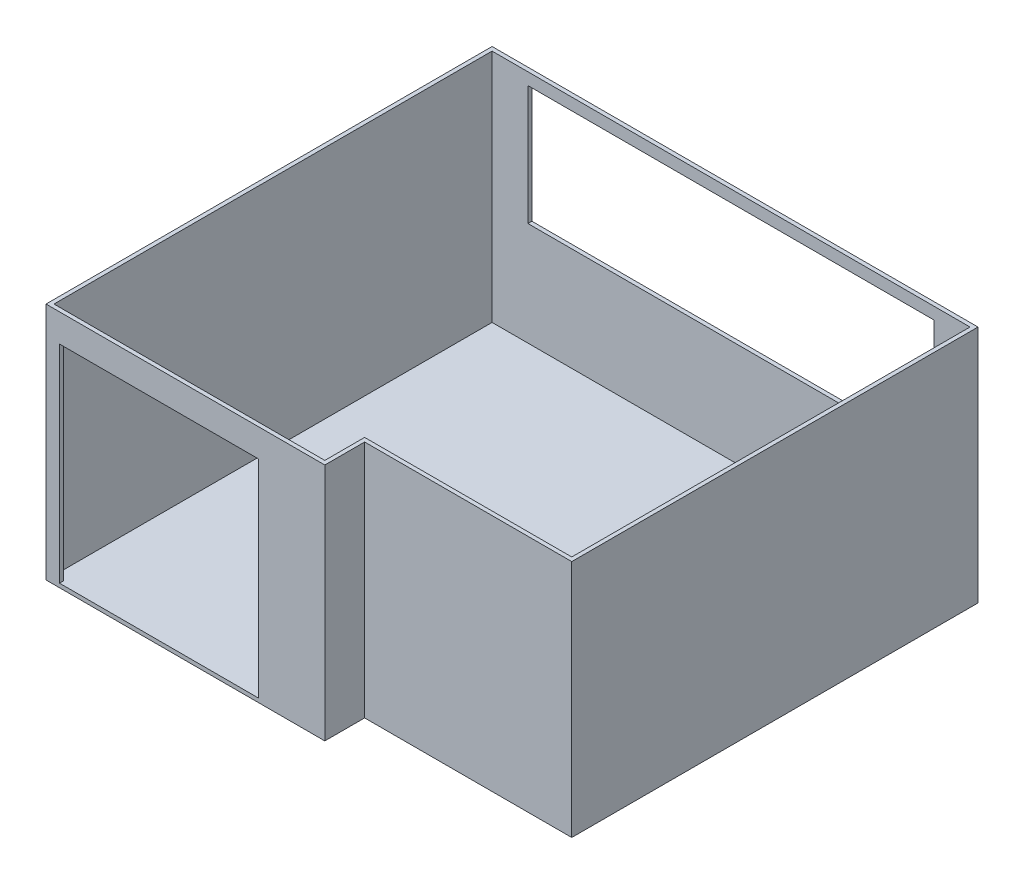
ISO-10303-21;
HEADER;
FILE_DESCRIPTION(('STEP AP214'),'2;1');
FILE_NAME('part.step','',(''),(''),'','','');
FILE_SCHEMA(('AUTOMOTIVE_DESIGN { 1 0 10303 214 1 1 1 1 }'));
ENDSEC;
DATA;
#1=APPLICATION_CONTEXT('core data for automotive mechanical design processes');
#2=APPLICATION_PROTOCOL_DEFINITION('international standard','automotive_design',2000,#1);
#3=PRODUCT_CONTEXT('',#1,'mechanical');
#4=PRODUCT('Part','Part','',(#3));
#5=PRODUCT_RELATED_PRODUCT_CATEGORY('part','',(#4));
#6=PRODUCT_DEFINITION_FORMATION('','',#4);
#7=PRODUCT_DEFINITION_CONTEXT('part definition',#1,'design');
#8=PRODUCT_DEFINITION('design','',#6,#7);
#9=PRODUCT_DEFINITION_SHAPE('','',#8);
#10=(LENGTH_UNIT() NAMED_UNIT(*) SI_UNIT(.MILLI.,.METRE.));
#11=(NAMED_UNIT(*) PLANE_ANGLE_UNIT() SI_UNIT($,.RADIAN.));
#12=(NAMED_UNIT(*) SI_UNIT($,.STERADIAN.) SOLID_ANGLE_UNIT());
#13=UNCERTAINTY_MEASURE_WITH_UNIT(LENGTH_MEASURE(1.E-05),#10,'distance_accuracy_value','');
#14=(GEOMETRIC_REPRESENTATION_CONTEXT(3) GLOBAL_UNCERTAINTY_ASSIGNED_CONTEXT((#13)) GLOBAL_UNIT_ASSIGNED_CONTEXT((#10,
#11,#12)) REPRESENTATION_CONTEXT('',''));
#15=CARTESIAN_POINT('',(0.,0.,0.));
#16=DIRECTION('',(0.,0.,1.));
#17=DIRECTION('',(1.,0.,0.));
#18=AXIS2_PLACEMENT_3D('',#15,#16,#17);
#19=CARTESIAN_POINT('',(-3050.,3000.,2800.));
#20=DIRECTION('',(1.,0.,0.));
#21=DIRECTION('',(0.,0.,-1.));
#22=AXIS2_PLACEMENT_3D('',#19,#20,#21);
#23=PLANE('',#22);
#24=DIRECTION('',(0.,0.,1.));
#25=VECTOR('',#24,1.);
#26=CARTESIAN_POINT('',(-3050.,0.,2800.));
#27=LINE('',#26,#25);
#28=CARTESIAN_POINT('',(-3050.,0.,-2800.));
#29=VERTEX_POINT('',#28);
#30=CARTESIAN_POINT('',(-3050.,0.,2800.));
#31=VERTEX_POINT('',#30);
#32=EDGE_CURVE('E227',#29,#31,#27,.T.);
#33=ORIENTED_EDGE('',*,*,#32,.T.);
#34=DIRECTION('',(0.,-1.,0.));
#35=VECTOR('',#34,1.);
#36=CARTESIAN_POINT('',(-3050.,3000.,2800.));
#37=LINE('',#36,#35);
#38=CARTESIAN_POINT('',(-3050.,3000.,2800.));
#39=VERTEX_POINT('',#38);
#40=EDGE_CURVE('E307',#39,#31,#37,.T.);
#41=ORIENTED_EDGE('',*,*,#40,.F.);
#42=DIRECTION('',(0.,0.,1.));
#43=VECTOR('',#42,1.);
#44=CARTESIAN_POINT('',(-3050.,3000.,2800.));
#45=LINE('',#44,#43);
#46=CARTESIAN_POINT('',(-3050.,3000.,-2800.));
#47=VERTEX_POINT('',#46);
#48=EDGE_CURVE('E267',#47,#39,#45,.T.);
#49=ORIENTED_EDGE('',*,*,#48,.F.);
#50=DIRECTION('',(0.,-1.,0.));
#51=VECTOR('',#50,1.);
#52=CARTESIAN_POINT('',(-3050.,3000.,-2800.));
#53=LINE('',#52,#51);
#54=EDGE_CURVE('E281',#47,#29,#53,.T.);
#55=ORIENTED_EDGE('',*,*,#54,.T.);
#56=EDGE_LOOP('',(#33,#41,#49,#55));
#57=FACE_BOUND('',#56,.T.);
#58=ADVANCED_FACE('F32',(#57),#23,.F.);
#59=CARTESIAN_POINT('',(450.000000000002,3000.,2800.));
#60=DIRECTION('',(0.,0.,-1.));
#61=DIRECTION('',(-1.,0.,0.));
#62=AXIS2_PLACEMENT_3D('',#59,#60,#61);
#63=PLANE('',#62);
#64=DIRECTION('',(1.,0.,0.));
#65=VECTOR('',#64,1.);
#66=CARTESIAN_POINT('',(-2880.,49.9999999999999,2800.));
#67=LINE('',#66,#65);
#68=CARTESIAN_POINT('',(-2880.,49.9999999999997,2800.));
#69=VERTEX_POINT('',#68);
#70=CARTESIAN_POINT('',(-379.999999999998,50.,2800.));
#71=VERTEX_POINT('',#70);
#72=EDGE_CURVE('E197',#69,#71,#67,.T.);
#73=ORIENTED_EDGE('',*,*,#72,.F.);
#74=DIRECTION('',(0.,-1.,0.));
#75=VECTOR('',#74,1.);
#76=CARTESIAN_POINT('',(-2880.,2650.,2800.));
#77=LINE('',#76,#75);
#78=CARTESIAN_POINT('',(-2880.,2650.,2800.));
#79=VERTEX_POINT('',#78);
#80=EDGE_CURVE('E193',#79,#69,#77,.T.);
#81=ORIENTED_EDGE('',*,*,#80,.F.);
#82=DIRECTION('',(-1.,0.,0.));
#83=VECTOR('',#82,1.);
#84=CARTESIAN_POINT('',(-2880.,2650.,2800.));
#85=LINE('',#84,#83);
#86=CARTESIAN_POINT('',(-379.999999999998,2650.,2800.));
#87=VERTEX_POINT('',#86);
#88=EDGE_CURVE('E203',#87,#79,#85,.T.);
#89=ORIENTED_EDGE('',*,*,#88,.F.);
#90=DIRECTION('',(0.,1.,0.));
#91=VECTOR('',#90,1.);
#92=CARTESIAN_POINT('',(-379.999999999998,2650.,2800.));
#93=LINE('',#92,#91);
#94=EDGE_CURVE('E200',#71,#87,#93,.T.);
#95=ORIENTED_EDGE('',*,*,#94,.F.);
#96=EDGE_LOOP('',(#73,#81,#89,#95));
#97=FACE_BOUND('',#96,.T.);
#98=DIRECTION('',(1.,0.,0.));
#99=VECTOR('',#98,1.);
#100=CARTESIAN_POINT('',(450.000000000002,0.,2800.));
#101=LINE('',#100,#99);
#102=CARTESIAN_POINT('',(450.000000000002,0.,2800.));
#103=VERTEX_POINT('',#102);
#104=EDGE_CURVE('E284',#31,#103,#101,.T.);
#105=ORIENTED_EDGE('',*,*,#104,.T.);
#106=DIRECTION('',(0.,-1.,0.));
#107=VECTOR('',#106,1.);
#108=CARTESIAN_POINT('',(450.000000000002,3000.,2800.));
#109=LINE('',#108,#107);
#110=CARTESIAN_POINT('',(450.000000000002,3000.,2800.));
#111=VERTEX_POINT('',#110);
#112=EDGE_CURVE('E304',#111,#103,#109,.T.);
#113=ORIENTED_EDGE('',*,*,#112,.F.);
#114=DIRECTION('',(1.,0.,0.));
#115=VECTOR('',#114,1.);
#116=CARTESIAN_POINT('',(450.000000000002,3000.,2800.));
#117=LINE('',#116,#115);
#118=EDGE_CURVE('E270',#39,#111,#117,.T.);
#119=ORIENTED_EDGE('',*,*,#118,.F.);
#120=ORIENTED_EDGE('',*,*,#40,.T.);
#121=EDGE_LOOP('',(#105,#113,#119,#120));
#122=FACE_BOUND('',#121,.T.);
#123=ADVANCED_FACE('F337',(#97,#122),#63,.F.);
#124=CARTESIAN_POINT('',(450.000000000002,3000.,2300.));
#125=DIRECTION('',(-1.,0.,0.));
#126=DIRECTION('',(0.,0.,1.));
#127=AXIS2_PLACEMENT_3D('',#124,#125,#126);
#128=PLANE('',#127);
#129=DIRECTION('',(0.,0.,-1.));
#130=VECTOR('',#129,1.);
#131=CARTESIAN_POINT('',(450.000000000002,0.,2300.));
#132=LINE('',#131,#130);
#133=CARTESIAN_POINT('',(450.000000000002,0.,2300.));
#134=VERTEX_POINT('',#133);
#135=EDGE_CURVE('E286',#103,#134,#132,.T.);
#136=ORIENTED_EDGE('',*,*,#135,.T.);
#137=DIRECTION('',(0.,-1.,0.));
#138=VECTOR('',#137,1.);
#139=CARTESIAN_POINT('',(450.000000000002,3000.,2300.));
#140=LINE('',#139,#138);
#141=CARTESIAN_POINT('',(450.000000000002,3000.,2300.));
#142=VERTEX_POINT('',#141);
#143=EDGE_CURVE('E301',#142,#134,#140,.T.);
#144=ORIENTED_EDGE('',*,*,#143,.F.);
#145=DIRECTION('',(0.,0.,-1.));
#146=VECTOR('',#145,1.);
#147=CARTESIAN_POINT('',(450.000000000002,3000.,2300.));
#148=LINE('',#147,#146);
#149=EDGE_CURVE('E273',#111,#142,#148,.T.);
#150=ORIENTED_EDGE('',*,*,#149,.F.);
#151=ORIENTED_EDGE('',*,*,#112,.T.);
#152=EDGE_LOOP('',(#136,#144,#150,#151));
#153=FACE_BOUND('',#152,.T.);
#154=ADVANCED_FACE('F343',(#153),#128,.F.);
#155=CARTESIAN_POINT('',(3050.,3000.,2300.));
#156=DIRECTION('',(0.,0.,-1.));
#157=DIRECTION('',(-1.,0.,0.));
#158=AXIS2_PLACEMENT_3D('',#155,#156,#157);
#159=PLANE('',#158);
#160=DIRECTION('',(1.,0.,0.));
#161=VECTOR('',#160,1.);
#162=CARTESIAN_POINT('',(3050.,0.,2300.));
#163=LINE('',#162,#161);
#164=CARTESIAN_POINT('',(3050.,0.,2300.));
#165=VERTEX_POINT('',#164);
#166=EDGE_CURVE('E288',#134,#165,#163,.T.);
#167=ORIENTED_EDGE('',*,*,#166,.T.);
#168=DIRECTION('',(0.,-1.,0.));
#169=VECTOR('',#168,1.);
#170=CARTESIAN_POINT('',(3050.,3000.,2300.));
#171=LINE('',#170,#169);
#172=CARTESIAN_POINT('',(3050.,3000.,2300.));
#173=VERTEX_POINT('',#172);
#174=EDGE_CURVE('E298',#173,#165,#171,.T.);
#175=ORIENTED_EDGE('',*,*,#174,.F.);
#176=DIRECTION('',(1.,0.,0.));
#177=VECTOR('',#176,1.);
#178=CARTESIAN_POINT('',(3050.,3000.,2300.));
#179=LINE('',#178,#177);
#180=EDGE_CURVE('E275',#142,#173,#179,.T.);
#181=ORIENTED_EDGE('',*,*,#180,.F.);
#182=ORIENTED_EDGE('',*,*,#143,.T.);
#183=EDGE_LOOP('',(#167,#175,#181,#182));
#184=FACE_BOUND('',#183,.T.);
#185=ADVANCED_FACE('F367',(#184),#159,.F.);
#186=CARTESIAN_POINT('',(3050.,3000.,2300.));
#187=DIRECTION('',(-1.,0.,0.));
#188=DIRECTION('',(0.,0.,1.));
#189=AXIS2_PLACEMENT_3D('',#186,#187,#188);
#190=PLANE('',#189);
#191=DIRECTION('',(0.,0.,-1.));
#192=VECTOR('',#191,1.);
#193=CARTESIAN_POINT('',(3050.,0.,2300.));
#194=LINE('',#193,#192);
#195=CARTESIAN_POINT('',(3050.,0.,-2800.));
#196=VERTEX_POINT('',#195);
#197=EDGE_CURVE('E290',#165,#196,#194,.T.);
#198=ORIENTED_EDGE('',*,*,#197,.T.);
#199=DIRECTION('',(0.,-1.,0.));
#200=VECTOR('',#199,1.);
#201=CARTESIAN_POINT('',(3050.,3000.,-2800.));
#202=LINE('',#201,#200);
#203=CARTESIAN_POINT('',(3050.,3000.,-2800.));
#204=VERTEX_POINT('',#203);
#205=EDGE_CURVE('E295',#204,#196,#202,.T.);
#206=ORIENTED_EDGE('',*,*,#205,.F.);
#207=DIRECTION('',(0.,0.,-1.));
#208=VECTOR('',#207,1.);
#209=CARTESIAN_POINT('',(3050.,3000.,2300.));
#210=LINE('',#209,#208);
#211=EDGE_CURVE('E277',#173,#204,#210,.T.);
#212=ORIENTED_EDGE('',*,*,#211,.F.);
#213=ORIENTED_EDGE('',*,*,#174,.T.);
#214=EDGE_LOOP('',(#198,#206,#212,#213));
#215=FACE_BOUND('',#214,.T.);
#216=ADVANCED_FACE('F364',(#215),#190,.F.);
#217=CARTESIAN_POINT('',(3050.,3000.,-2800.));
#218=DIRECTION('',(0.,0.,1.));
#219=DIRECTION('',(1.,0.,0.));
#220=AXIS2_PLACEMENT_3D('',#217,#218,#219);
#221=PLANE('',#220);
#222=DIRECTION('',(-1.,0.,0.));
#223=VECTOR('',#222,1.);
#224=CARTESIAN_POINT('',(-2550.,1350.,-2800.));
#225=LINE('',#224,#223);
#226=CARTESIAN_POINT('',(2550.,1350.,-2800.));
#227=VERTEX_POINT('',#226);
#228=CARTESIAN_POINT('',(-2550.,1350.,-2800.));
#229=VERTEX_POINT('',#228);
#230=EDGE_CURVE('E179',#227,#229,#225,.T.);
#231=ORIENTED_EDGE('',*,*,#230,.F.);
#232=DIRECTION('',(0.,-1.,0.));
#233=VECTOR('',#232,1.);
#234=CARTESIAN_POINT('',(2550.,1350.,-2800.));
#235=LINE('',#234,#233);
#236=CARTESIAN_POINT('',(2550.,2850.,-2800.));
#237=VERTEX_POINT('',#236);
#238=EDGE_CURVE('E46',#237,#227,#235,.T.);
#239=ORIENTED_EDGE('',*,*,#238,.F.);
#240=DIRECTION('',(1.,0.,0.));
#241=VECTOR('',#240,1.);
#242=CARTESIAN_POINT('',(-2550.,2850.,-2800.));
#243=LINE('',#242,#241);
#244=CARTESIAN_POINT('',(-2550.,2850.,-2800.));
#245=VERTEX_POINT('',#244);
#246=EDGE_CURVE('E186',#245,#237,#243,.T.);
#247=ORIENTED_EDGE('',*,*,#246,.F.);
#248=DIRECTION('',(0.,1.,0.));
#249=VECTOR('',#248,1.);
#250=CARTESIAN_POINT('',(-2550.,1350.,-2800.));
#251=LINE('',#250,#249);
#252=EDGE_CURVE('E170',#229,#245,#251,.T.);
#253=ORIENTED_EDGE('',*,*,#252,.F.);
#254=EDGE_LOOP('',(#231,#239,#247,#253));
#255=FACE_BOUND('',#254,.T.);
#256=DIRECTION('',(-1.,0.,0.));
#257=VECTOR('',#256,1.);
#258=CARTESIAN_POINT('',(3050.,0.,-2800.));
#259=LINE('',#258,#257);
#260=EDGE_CURVE('E271',#196,#29,#259,.T.);
#261=ORIENTED_EDGE('',*,*,#260,.T.);
#262=ORIENTED_EDGE('',*,*,#54,.F.);
#263=DIRECTION('',(-1.,0.,0.));
#264=VECTOR('',#263,1.);
#265=CARTESIAN_POINT('',(3050.,3000.,-2800.));
#266=LINE('',#265,#264);
#267=EDGE_CURVE('E279',#204,#47,#266,.T.);
#268=ORIENTED_EDGE('',*,*,#267,.F.);
#269=ORIENTED_EDGE('',*,*,#205,.T.);
#270=EDGE_LOOP('',(#261,#262,#268,#269));
#271=FACE_BOUND('',#270,.T.);
#272=ADVANCED_FACE('F183',(#255,#271),#221,.F.);
#273=CARTESIAN_POINT('',(0.,3000.,0.));
#274=DIRECTION('',(0.,1.,0.));
#275=DIRECTION('',(0.,0.,1.));
#276=AXIS2_PLACEMENT_3D('',#273,#274,#275);
#277=PLANE('',#276);
#278=DIRECTION('',(0.,0.,1.));
#279=VECTOR('',#278,1.);
#280=CARTESIAN_POINT('',(-3000.,3000.,2800.));
#281=LINE('',#280,#279);
#282=CARTESIAN_POINT('',(-3000.,3000.,-2750.));
#283=VERTEX_POINT('',#282);
#284=CARTESIAN_POINT('',(-3000.,3000.,2750.));
#285=VERTEX_POINT('',#284);
#286=EDGE_CURVE('E255',#283,#285,#281,.T.);
#287=ORIENTED_EDGE('',*,*,#286,.F.);
#288=DIRECTION('',(-1.,0.,0.));
#289=VECTOR('',#288,1.);
#290=CARTESIAN_POINT('',(3050.,3000.,-2750.));
#291=LINE('',#290,#289);
#292=CARTESIAN_POINT('',(3000.,3000.,-2750.));
#293=VERTEX_POINT('',#292);
#294=EDGE_CURVE('E233',#293,#283,#291,.T.);
#295=ORIENTED_EDGE('',*,*,#294,.F.);
#296=DIRECTION('',(0.,0.,-1.));
#297=VECTOR('',#296,1.);
#298=CARTESIAN_POINT('',(3000.,3000.,2300.));
#299=LINE('',#298,#297);
#300=CARTESIAN_POINT('',(3000.,3000.,2250.));
#301=VERTEX_POINT('',#300);
#302=EDGE_CURVE('E263',#301,#293,#299,.T.);
#303=ORIENTED_EDGE('',*,*,#302,.F.);
#304=DIRECTION('',(1.,0.,0.));
#305=VECTOR('',#304,1.);
#306=CARTESIAN_POINT('',(3050.,3000.,2250.));
#307=LINE('',#306,#305);
#308=CARTESIAN_POINT('',(400.000000000002,3000.,2250.));
#309=VERTEX_POINT('',#308);
#310=EDGE_CURVE('E261',#309,#301,#307,.T.);
#311=ORIENTED_EDGE('',*,*,#310,.F.);
#312=DIRECTION('',(0.,0.,-1.));
#313=VECTOR('',#312,1.);
#314=CARTESIAN_POINT('',(400.000000000002,3000.,2300.));
#315=LINE('',#314,#313);
#316=CARTESIAN_POINT('',(400.000000000002,3000.,2750.));
#317=VERTEX_POINT('',#316);
#318=EDGE_CURVE('E259',#317,#309,#315,.T.);
#319=ORIENTED_EDGE('',*,*,#318,.F.);
#320=DIRECTION('',(1.,0.,0.));
#321=VECTOR('',#320,1.);
#322=CARTESIAN_POINT('',(450.000000000002,3000.,2750.));
#323=LINE('',#322,#321);
#324=EDGE_CURVE('E257',#285,#317,#323,.T.);
#325=ORIENTED_EDGE('',*,*,#324,.F.);
#326=EDGE_LOOP('',(#287,#295,#303,#311,#319,#325));
#327=FACE_BOUND('',#326,.T.);
#328=ORIENTED_EDGE('',*,*,#48,.T.);
#329=ORIENTED_EDGE('',*,*,#118,.T.);
#330=ORIENTED_EDGE('',*,*,#149,.T.);
#331=ORIENTED_EDGE('',*,*,#180,.T.);
#332=ORIENTED_EDGE('',*,*,#211,.T.);
#333=ORIENTED_EDGE('',*,*,#267,.T.);
#334=EDGE_LOOP('',(#328,#329,#330,#331,#332,#333));
#335=FACE_BOUND('',#334,.T.);
#336=ADVANCED_FACE('F359',(#327,#335),#277,.T.);
#337=CARTESIAN_POINT('',(0.,0.,0.));
#338=DIRECTION('',(0.,1.,0.));
#339=DIRECTION('',(0.,0.,1.));
#340=AXIS2_PLACEMENT_3D('',#337,#338,#339);
#341=PLANE('',#340);
#342=ORIENTED_EDGE('',*,*,#32,.F.);
#343=ORIENTED_EDGE('',*,*,#260,.F.);
#344=ORIENTED_EDGE('',*,*,#197,.F.);
#345=ORIENTED_EDGE('',*,*,#166,.F.);
#346=ORIENTED_EDGE('',*,*,#135,.F.);
#347=ORIENTED_EDGE('',*,*,#104,.F.);
#348=EDGE_LOOP('',(#342,#343,#344,#345,#346,#347));
#349=FACE_BOUND('',#348,.T.);
#350=ADVANCED_FACE('F351',(#349),#341,.F.);
#351=CARTESIAN_POINT('',(-3000.,3000.,2800.));
#352=DIRECTION('',(1.,0.,0.));
#353=DIRECTION('',(0.,0.,-1.));
#354=AXIS2_PLACEMENT_3D('',#351,#352,#353);
#355=PLANE('',#354);
#356=DIRECTION('',(0.,0.,1.));
#357=VECTOR('',#356,1.);
#358=CARTESIAN_POINT('',(-3000.,49.9999999999998,2800.));
#359=LINE('',#358,#357);
#360=CARTESIAN_POINT('',(-3000.,50.,-2750.));
#361=VERTEX_POINT('',#360);
#362=CARTESIAN_POINT('',(-3000.,50.,2750.));
#363=VERTEX_POINT('',#362);
#364=EDGE_CURVE('E220',#361,#363,#359,.T.);
#365=ORIENTED_EDGE('',*,*,#364,.F.);
#366=DIRECTION('',(0.,-1.,0.));
#367=VECTOR('',#366,1.);
#368=CARTESIAN_POINT('',(-3000.,3000.,-2750.));
#369=LINE('',#368,#367);
#370=EDGE_CURVE('E229',#283,#361,#369,.T.);
#371=ORIENTED_EDGE('',*,*,#370,.F.);
#372=ORIENTED_EDGE('',*,*,#286,.T.);
#373=DIRECTION('',(0.,-1.,0.));
#374=VECTOR('',#373,1.);
#375=CARTESIAN_POINT('',(-3000.,3000.,2750.));
#376=LINE('',#375,#374);
#377=EDGE_CURVE('E224',#285,#363,#376,.T.);
#378=ORIENTED_EDGE('',*,*,#377,.T.);
#379=EDGE_LOOP('',(#365,#371,#372,#378));
#380=FACE_BOUND('',#379,.T.);
#381=ADVANCED_FACE('F384',(#380),#355,.T.);
#382=CARTESIAN_POINT('',(450.000000000002,3000.,2750.));
#383=DIRECTION('',(0.,0.,-1.));
#384=DIRECTION('',(-1.,0.,0.));
#385=AXIS2_PLACEMENT_3D('',#382,#383,#384);
#386=PLANE('',#385);
#387=DIRECTION('',(0.,1.,0.));
#388=VECTOR('',#387,1.);
#389=CARTESIAN_POINT('',(-2880.,3000.,2750.));
#390=LINE('',#389,#388);
#391=CARTESIAN_POINT('',(-2880.,49.9999999999999,2750.));
#392=VERTEX_POINT('',#391);
#393=CARTESIAN_POINT('',(-2880.,2650.,2750.));
#394=VERTEX_POINT('',#393);
#395=EDGE_CURVE('E218',#392,#394,#390,.T.);
#396=ORIENTED_EDGE('',*,*,#395,.F.);
#397=DIRECTION('',(1.,0.,0.));
#398=VECTOR('',#397,1.);
#399=CARTESIAN_POINT('',(450.000000000002,49.9999999999998,2750.));
#400=LINE('',#399,#398);
#401=EDGE_CURVE('E234',#363,#392,#400,.T.);
#402=ORIENTED_EDGE('',*,*,#401,.F.);
#403=ORIENTED_EDGE('',*,*,#377,.F.);
#404=ORIENTED_EDGE('',*,*,#324,.T.);
#405=DIRECTION('',(0.,-1.,0.));
#406=VECTOR('',#405,1.);
#407=CARTESIAN_POINT('',(400.000000000002,3000.,2750.));
#408=LINE('',#407,#406);
#409=CARTESIAN_POINT('',(400.000000000002,50.,2750.));
#410=VERTEX_POINT('',#409);
#411=EDGE_CURVE('E228',#317,#410,#408,.T.);
#412=ORIENTED_EDGE('',*,*,#411,.T.);
#413=CARTESIAN_POINT('',(-379.999999999998,49.9999999999998,2750.));
#414=VERTEX_POINT('',#413);
#415=EDGE_CURVE('E223',#414,#410,#400,.T.);
#416=ORIENTED_EDGE('',*,*,#415,.F.);
#417=DIRECTION('',(0.,-1.,0.));
#418=VECTOR('',#417,1.);
#419=CARTESIAN_POINT('',(-379.999999999999,3000.,2750.));
#420=LINE('',#419,#418);
#421=CARTESIAN_POINT('',(-379.999999999998,2650.,2750.));
#422=VERTEX_POINT('',#421);
#423=EDGE_CURVE('E209',#422,#414,#420,.T.);
#424=ORIENTED_EDGE('',*,*,#423,.F.);
#425=DIRECTION('',(1.,0.,0.));
#426=VECTOR('',#425,1.);
#427=CARTESIAN_POINT('',(450.000000000002,2650.,2750.));
#428=LINE('',#427,#426);
#429=EDGE_CURVE('E310',#394,#422,#428,.T.);
#430=ORIENTED_EDGE('',*,*,#429,.F.);
#431=EDGE_LOOP('',(#396,#402,#403,#404,#412,#416,#424,#430));
#432=FACE_BOUND('',#431,.T.);
#433=ADVANCED_FACE('F406',(#432),#386,.T.);
#434=CARTESIAN_POINT('',(400.000000000002,3000.,2300.));
#435=DIRECTION('',(-1.,0.,0.));
#436=DIRECTION('',(0.,0.,1.));
#437=AXIS2_PLACEMENT_3D('',#434,#435,#436);
#438=PLANE('',#437);
#439=DIRECTION('',(0.,0.,-1.));
#440=VECTOR('',#439,1.);
#441=CARTESIAN_POINT('',(400.000000000002,49.9999999999998,2300.));
#442=LINE('',#441,#440);
#443=CARTESIAN_POINT('',(400.000000000002,50.,2250.));
#444=VERTEX_POINT('',#443);
#445=EDGE_CURVE('E237',#410,#444,#442,.T.);
#446=ORIENTED_EDGE('',*,*,#445,.F.);
#447=ORIENTED_EDGE('',*,*,#411,.F.);
#448=ORIENTED_EDGE('',*,*,#318,.T.);
#449=DIRECTION('',(0.,-1.,0.));
#450=VECTOR('',#449,1.);
#451=CARTESIAN_POINT('',(400.000000000002,3000.,2250.));
#452=LINE('',#451,#450);
#453=EDGE_CURVE('E240',#309,#444,#452,.T.);
#454=ORIENTED_EDGE('',*,*,#453,.T.);
#455=EDGE_LOOP('',(#446,#447,#448,#454));
#456=FACE_BOUND('',#455,.T.);
#457=ADVANCED_FACE('F402',(#456),#438,.T.);
#458=CARTESIAN_POINT('',(3050.,3000.,2250.));
#459=DIRECTION('',(0.,0.,-1.));
#460=DIRECTION('',(-1.,0.,0.));
#461=AXIS2_PLACEMENT_3D('',#458,#459,#460);
#462=PLANE('',#461);
#463=DIRECTION('',(1.,0.,0.));
#464=VECTOR('',#463,1.);
#465=CARTESIAN_POINT('',(3050.,49.9999999999998,2250.));
#466=LINE('',#465,#464);
#467=CARTESIAN_POINT('',(3000.,50.,2250.));
#468=VERTEX_POINT('',#467);
#469=EDGE_CURVE('E242',#444,#468,#466,.T.);
#470=ORIENTED_EDGE('',*,*,#469,.F.);
#471=ORIENTED_EDGE('',*,*,#453,.F.);
#472=ORIENTED_EDGE('',*,*,#310,.T.);
#473=DIRECTION('',(0.,-1.,0.));
#474=VECTOR('',#473,1.);
#475=CARTESIAN_POINT('',(3000.,3000.,2250.));
#476=LINE('',#475,#474);
#477=EDGE_CURVE('E245',#301,#468,#476,.T.);
#478=ORIENTED_EDGE('',*,*,#477,.T.);
#479=EDGE_LOOP('',(#470,#471,#472,#478));
#480=FACE_BOUND('',#479,.T.);
#481=ADVANCED_FACE('F398',(#480),#462,.T.);
#482=CARTESIAN_POINT('',(3000.,3000.,2300.));
#483=DIRECTION('',(-1.,0.,0.));
#484=DIRECTION('',(0.,0.,1.));
#485=AXIS2_PLACEMENT_3D('',#482,#483,#484);
#486=PLANE('',#485);
#487=DIRECTION('',(0.,0.,-1.));
#488=VECTOR('',#487,1.);
#489=CARTESIAN_POINT('',(3000.,49.9999999999998,2300.));
#490=LINE('',#489,#488);
#491=CARTESIAN_POINT('',(3000.,50.,-2750.));
#492=VERTEX_POINT('',#491);
#493=EDGE_CURVE('E247',#468,#492,#490,.T.);
#494=ORIENTED_EDGE('',*,*,#493,.F.);
#495=ORIENTED_EDGE('',*,*,#477,.F.);
#496=ORIENTED_EDGE('',*,*,#302,.T.);
#497=DIRECTION('',(0.,-1.,0.));
#498=VECTOR('',#497,1.);
#499=CARTESIAN_POINT('',(3000.,3000.,-2750.));
#500=LINE('',#499,#498);
#501=EDGE_CURVE('E232',#293,#492,#500,.T.);
#502=ORIENTED_EDGE('',*,*,#501,.T.);
#503=EDGE_LOOP('',(#494,#495,#496,#502));
#504=FACE_BOUND('',#503,.T.);
#505=ADVANCED_FACE('F395',(#504),#486,.T.);
#506=CARTESIAN_POINT('',(3050.,3000.,-2750.));
#507=DIRECTION('',(0.,0.,1.));
#508=DIRECTION('',(1.,0.,0.));
#509=AXIS2_PLACEMENT_3D('',#506,#507,#508);
#510=PLANE('',#509);
#511=DIRECTION('',(0.,1.,0.));
#512=VECTOR('',#511,1.);
#513=CARTESIAN_POINT('',(2550.,3000.,-2750.));
#514=LINE('',#513,#512);
#515=CARTESIAN_POINT('',(2550.,1350.,-2750.));
#516=VERTEX_POINT('',#515);
#517=CARTESIAN_POINT('',(2550.,2850.,-2750.));
#518=VERTEX_POINT('',#517);
#519=EDGE_CURVE('E11',#516,#518,#514,.T.);
#520=ORIENTED_EDGE('',*,*,#519,.F.);
#521=DIRECTION('',(1.,0.,0.));
#522=VECTOR('',#521,1.);
#523=CARTESIAN_POINT('',(3050.,1350.,-2750.));
#524=LINE('',#523,#522);
#525=CARTESIAN_POINT('',(-2550.,1350.,-2750.));
#526=VERTEX_POINT('',#525);
#527=EDGE_CURVE('E312',#526,#516,#524,.T.);
#528=ORIENTED_EDGE('',*,*,#527,.F.);
#529=DIRECTION('',(0.,-1.,0.));
#530=VECTOR('',#529,1.);
#531=CARTESIAN_POINT('',(-2550.,3000.,-2750.));
#532=LINE('',#531,#530);
#533=CARTESIAN_POINT('',(-2550.,2850.,-2750.));
#534=VERTEX_POINT('',#533);
#535=EDGE_CURVE('E173',#534,#526,#532,.T.);
#536=ORIENTED_EDGE('',*,*,#535,.F.);
#537=DIRECTION('',(-1.,0.,0.));
#538=VECTOR('',#537,1.);
#539=CARTESIAN_POINT('',(3050.,2850.,-2750.));
#540=LINE('',#539,#538);
#541=EDGE_CURVE('E39',#518,#534,#540,.T.);
#542=ORIENTED_EDGE('',*,*,#541,.F.);
#543=EDGE_LOOP('',(#520,#528,#536,#542));
#544=FACE_BOUND('',#543,.T.);
#545=DIRECTION('',(-1.,0.,0.));
#546=VECTOR('',#545,1.);
#547=CARTESIAN_POINT('',(3050.,49.9999999999998,-2750.));
#548=LINE('',#547,#546);
#549=EDGE_CURVE('E251',#492,#361,#548,.T.);
#550=ORIENTED_EDGE('',*,*,#549,.F.);
#551=ORIENTED_EDGE('',*,*,#501,.F.);
#552=ORIENTED_EDGE('',*,*,#294,.T.);
#553=ORIENTED_EDGE('',*,*,#370,.T.);
#554=EDGE_LOOP('',(#550,#551,#552,#553));
#555=FACE_BOUND('',#554,.T.);
#556=ADVANCED_FACE('F320',(#544,#555),#510,.T.);
#557=CARTESIAN_POINT('',(0.,50.,0.));
#558=DIRECTION('',(0.,1.,0.));
#559=DIRECTION('',(0.,0.,1.));
#560=AXIS2_PLACEMENT_3D('',#557,#558,#559);
#561=PLANE('',#560);
#562=ORIENTED_EDGE('',*,*,#401,.T.);
#563=DIRECTION('',(0.,0.,1.));
#564=VECTOR('',#563,1.);
#565=CARTESIAN_POINT('',(-2880.,49.9999999999999,-200.));
#566=LINE('',#565,#564);
#567=EDGE_CURVE('E206',#392,#69,#566,.T.);
#568=ORIENTED_EDGE('',*,*,#567,.T.);
#569=ORIENTED_EDGE('',*,*,#72,.T.);
#570=DIRECTION('',(0.,0.,1.));
#571=VECTOR('',#570,1.);
#572=CARTESIAN_POINT('',(-379.999999999998,50.,-200.));
#573=LINE('',#572,#571);
#574=EDGE_CURVE('E212',#414,#71,#573,.T.);
#575=ORIENTED_EDGE('',*,*,#574,.F.);
#576=ORIENTED_EDGE('',*,*,#415,.T.);
#577=ORIENTED_EDGE('',*,*,#445,.T.);
#578=ORIENTED_EDGE('',*,*,#469,.T.);
#579=ORIENTED_EDGE('',*,*,#493,.T.);
#580=ORIENTED_EDGE('',*,*,#549,.T.);
#581=ORIENTED_EDGE('',*,*,#364,.T.);
#582=EDGE_LOOP('',(#562,#568,#569,#575,#576,#577,#578,#579,#580,#581));
#583=FACE_BOUND('',#582,.T.);
#584=ADVANCED_FACE('F388',(#583),#561,.T.);
#585=CARTESIAN_POINT('',(-2880.,2650.,-200.));
#586=DIRECTION('',(-1.,0.,0.));
#587=DIRECTION('',(0.,-1.,0.));
#588=AXIS2_PLACEMENT_3D('',#585,#586,#587);
#589=PLANE('',#588);
#590=ORIENTED_EDGE('',*,*,#395,.T.);
#591=DIRECTION('',(0.,0.,1.));
#592=VECTOR('',#591,1.);
#593=CARTESIAN_POINT('',(-2880.,2650.,-200.));
#594=LINE('',#593,#592);
#595=EDGE_CURVE('E207',#394,#79,#594,.T.);
#596=ORIENTED_EDGE('',*,*,#595,.T.);
#597=ORIENTED_EDGE('',*,*,#80,.T.);
#598=ORIENTED_EDGE('',*,*,#567,.F.);
#599=EDGE_LOOP('',(#590,#596,#597,#598));
#600=FACE_BOUND('',#599,.T.);
#601=ADVANCED_FACE('F391',(#600),#589,.F.);
#602=CARTESIAN_POINT('',(-2880.,2650.,-200.));
#603=DIRECTION('',(0.,1.,0.));
#604=DIRECTION('',(0.,0.,1.));
#605=AXIS2_PLACEMENT_3D('',#602,#603,#604);
#606=PLANE('',#605);
#607=ORIENTED_EDGE('',*,*,#429,.T.);
#608=DIRECTION('',(0.,0.,1.));
#609=VECTOR('',#608,1.);
#610=CARTESIAN_POINT('',(-379.999999999998,2650.,-200.));
#611=LINE('',#610,#609);
#612=EDGE_CURVE('E210',#422,#87,#611,.T.);
#613=ORIENTED_EDGE('',*,*,#612,.T.);
#614=ORIENTED_EDGE('',*,*,#88,.T.);
#615=ORIENTED_EDGE('',*,*,#595,.F.);
#616=EDGE_LOOP('',(#607,#613,#614,#615));
#617=FACE_BOUND('',#616,.T.);
#618=ADVANCED_FACE('F331',(#617),#606,.F.);
#619=CARTESIAN_POINT('',(-379.999999999998,2650.,-200.));
#620=DIRECTION('',(1.,0.,0.));
#621=DIRECTION('',(0.,1.,0.));
#622=AXIS2_PLACEMENT_3D('',#619,#620,#621);
#623=PLANE('',#622);
#624=ORIENTED_EDGE('',*,*,#423,.T.);
#625=ORIENTED_EDGE('',*,*,#574,.T.);
#626=ORIENTED_EDGE('',*,*,#94,.T.);
#627=ORIENTED_EDGE('',*,*,#612,.F.);
#628=EDGE_LOOP('',(#624,#625,#626,#627));
#629=FACE_BOUND('',#628,.T.);
#630=ADVANCED_FACE('F324',(#629),#623,.F.);
#631=CARTESIAN_POINT('',(2550.,1350.,200.));
#632=DIRECTION('',(1.,0.,0.));
#633=DIRECTION('',(0.,1.,0.));
#634=AXIS2_PLACEMENT_3D('',#631,#632,#633);
#635=PLANE('',#634);
#636=ORIENTED_EDGE('',*,*,#519,.T.);
#637=DIRECTION('',(0.,0.,-1.));
#638=VECTOR('',#637,1.);
#639=CARTESIAN_POINT('',(2550.,2850.,200.));
#640=LINE('',#639,#638);
#641=EDGE_CURVE('E191',#518,#237,#640,.T.);
#642=ORIENTED_EDGE('',*,*,#641,.T.);
#643=ORIENTED_EDGE('',*,*,#238,.T.);
#644=DIRECTION('',(0.,0.,-1.));
#645=VECTOR('',#644,1.);
#646=CARTESIAN_POINT('',(2550.,1350.,200.));
#647=LINE('',#646,#645);
#648=EDGE_CURVE('E176',#516,#227,#647,.T.);
#649=ORIENTED_EDGE('',*,*,#648,.F.);
#650=EDGE_LOOP('',(#636,#642,#643,#649));
#651=FACE_BOUND('',#650,.T.);
#652=ADVANCED_FACE('F322',(#651),#635,.F.);
#653=CARTESIAN_POINT('',(-2550.,2850.,200.000000000001));
#654=DIRECTION('',(0.,1.,0.));
#655=DIRECTION('',(-1.,0.,0.));
#656=AXIS2_PLACEMENT_3D('',#653,#654,#655);
#657=PLANE('',#656);
#658=ORIENTED_EDGE('',*,*,#541,.T.);
#659=DIRECTION('',(0.,0.,-1.));
#660=VECTOR('',#659,1.);
#661=CARTESIAN_POINT('',(-2550.,2850.,200.000000000001));
#662=LINE('',#661,#660);
#663=EDGE_CURVE('E175',#534,#245,#662,.T.);
#664=ORIENTED_EDGE('',*,*,#663,.T.);
#665=ORIENTED_EDGE('',*,*,#246,.T.);
#666=ORIENTED_EDGE('',*,*,#641,.F.);
#667=EDGE_LOOP('',(#658,#664,#665,#666));
#668=FACE_BOUND('',#667,.T.);
#669=ADVANCED_FACE('F317',(#668),#657,.F.);
#670=CARTESIAN_POINT('',(-2550.,1350.,200.000000000001));
#671=DIRECTION('',(-1.,0.,0.));
#672=DIRECTION('',(0.,-1.,0.));
#673=AXIS2_PLACEMENT_3D('',#670,#671,#672);
#674=PLANE('',#673);
#675=ORIENTED_EDGE('',*,*,#535,.T.);
#676=DIRECTION('',(0.,0.,-1.));
#677=VECTOR('',#676,1.);
#678=CARTESIAN_POINT('',(-2550.,1350.,200.000000000001));
#679=LINE('',#678,#677);
#680=EDGE_CURVE('E54',#526,#229,#679,.T.);
#681=ORIENTED_EDGE('',*,*,#680,.T.);
#682=ORIENTED_EDGE('',*,*,#252,.T.);
#683=ORIENTED_EDGE('',*,*,#663,.F.);
#684=EDGE_LOOP('',(#675,#681,#682,#683));
#685=FACE_BOUND('',#684,.T.);
#686=ADVANCED_FACE('F167',(#685),#674,.F.);
#687=CARTESIAN_POINT('',(-2550.,1350.,200.000000000001));
#688=DIRECTION('',(0.,-1.,0.));
#689=DIRECTION('',(1.,0.,0.));
#690=AXIS2_PLACEMENT_3D('',#687,#688,#689);
#691=PLANE('',#690);
#692=ORIENTED_EDGE('',*,*,#527,.T.);
#693=ORIENTED_EDGE('',*,*,#648,.T.);
#694=ORIENTED_EDGE('',*,*,#230,.T.);
#695=ORIENTED_EDGE('',*,*,#680,.F.);
#696=EDGE_LOOP('',(#692,#693,#694,#695));
#697=FACE_BOUND('',#696,.T.);
#698=ADVANCED_FACE('F180',(#697),#691,.F.);
#699=CLOSED_SHELL('',(#58,#123,#154,#185,#216,#272,#336,#350,#381,#433,#457,#481,#505,#556,#584,
#601,#618,#630,#652,#669,#686,#698));
#700=MANIFOLD_SOLID_BREP('B2',#699);
#701=ADVANCED_BREP_SHAPE_REPRESENTATION('',(#18,#700),#14);
#702=SHAPE_DEFINITION_REPRESENTATION(#9,#701);
ENDSEC;
END-ISO-10303-21;
